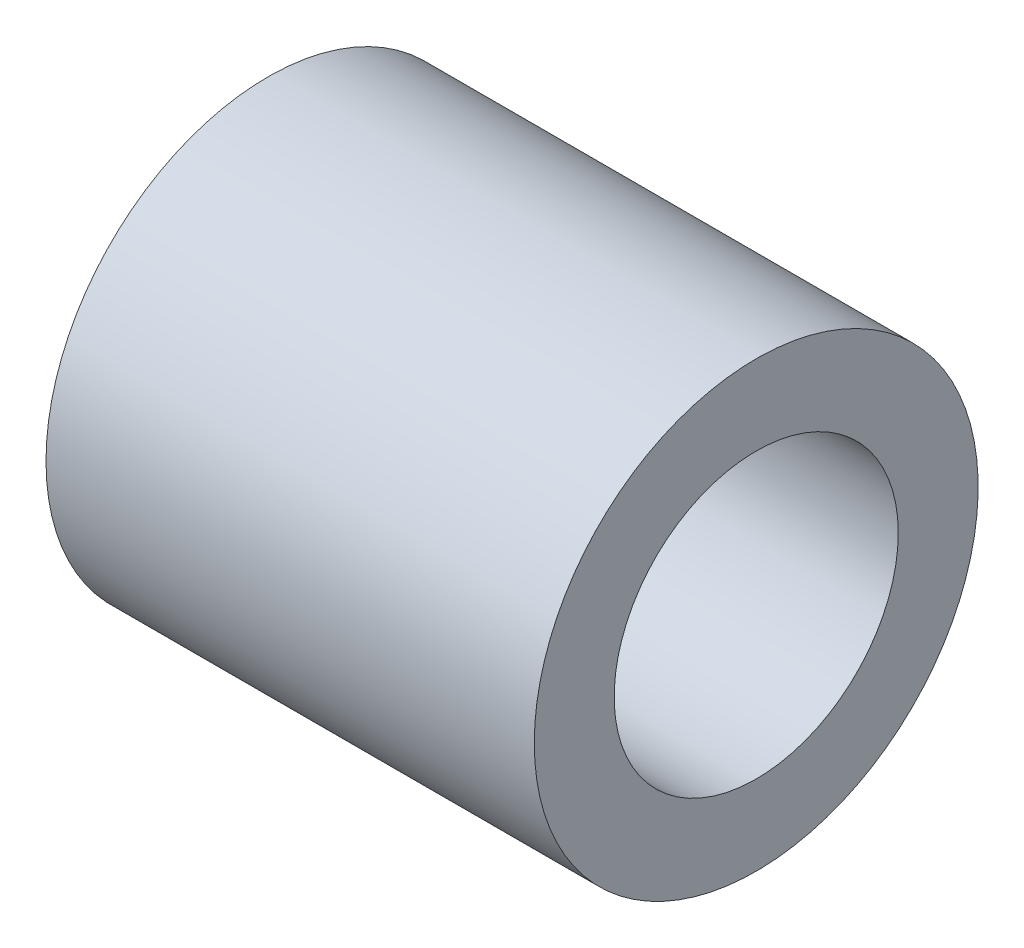
ISO-10303-21;
HEADER;
FILE_DESCRIPTION(('STEP AP214'),'2;1');
FILE_NAME('part.step','',(''),(''),'','','');
FILE_SCHEMA(('AUTOMOTIVE_DESIGN { 1 0 10303 214 1 1 1 1 }'));
ENDSEC;
DATA;
#1=APPLICATION_CONTEXT('core data for automotive mechanical design processes');
#2=APPLICATION_PROTOCOL_DEFINITION('international standard','automotive_design',2000,#1);
#3=PRODUCT_CONTEXT('',#1,'mechanical');
#4=PRODUCT('Part','Part','',(#3));
#5=PRODUCT_RELATED_PRODUCT_CATEGORY('part','',(#4));
#6=PRODUCT_DEFINITION_FORMATION('','',#4);
#7=PRODUCT_DEFINITION_CONTEXT('part definition',#1,'design');
#8=PRODUCT_DEFINITION('design','',#6,#7);
#9=PRODUCT_DEFINITION_SHAPE('','',#8);
#10=(LENGTH_UNIT() NAMED_UNIT(*) SI_UNIT(.MILLI.,.METRE.));
#11=(NAMED_UNIT(*) PLANE_ANGLE_UNIT() SI_UNIT($,.RADIAN.));
#12=(NAMED_UNIT(*) SI_UNIT($,.STERADIAN.) SOLID_ANGLE_UNIT());
#13=UNCERTAINTY_MEASURE_WITH_UNIT(LENGTH_MEASURE(1.E-05),#10,'distance_accuracy_value','');
#14=(GEOMETRIC_REPRESENTATION_CONTEXT(3) GLOBAL_UNCERTAINTY_ASSIGNED_CONTEXT((#13)) GLOBAL_UNIT_ASSIGNED_CONTEXT((#10,
#11,#12)) REPRESENTATION_CONTEXT('',''));
#15=CARTESIAN_POINT('',(0.,0.,0.));
#16=DIRECTION('',(0.,0.,1.));
#17=DIRECTION('',(1.,0.,0.));
#18=AXIS2_PLACEMENT_3D('',#15,#16,#17);
#19=CARTESIAN_POINT('',(0.,0.,0.));
#20=DIRECTION('',(1.,0.,0.));
#21=DIRECTION('',(0.,0.,-1.));
#22=AXIS2_PLACEMENT_3D('',#19,#20,#21);
#23=PLANE('',#22);
#24=CARTESIAN_POINT('',(0.,0.,0.));
#25=DIRECTION('',(1.,0.,0.));
#26=DIRECTION('',(0.,0.,-1.));
#27=AXIS2_PLACEMENT_3D('',#24,#25,#26);
#28=CIRCLE('',#27,1.6);
#29=CARTESIAN_POINT('',(0.,0.,-1.6));
#30=VERTEX_POINT('',#29);
#31=EDGE_CURVE('E40',#30,#30,#28,.F.);
#32=ORIENTED_EDGE('',*,*,#31,.F.);
#33=EDGE_LOOP('',(#32));
#34=FACE_BOUND('',#33,.T.);
#35=CARTESIAN_POINT('',(0.,0.,0.));
#36=DIRECTION('',(-1.,0.,0.));
#37=DIRECTION('',(0.,0.,1.));
#38=AXIS2_PLACEMENT_3D('',#35,#36,#37);
#39=CIRCLE('',#38,2.5);
#40=CARTESIAN_POINT('',(0.,0.,2.5));
#41=VERTEX_POINT('',#40);
#42=EDGE_CURVE('E10',#41,#41,#39,.T.);
#43=ORIENTED_EDGE('',*,*,#42,.T.);
#44=EDGE_LOOP('',(#43));
#45=FACE_BOUND('',#44,.T.);
#46=ADVANCED_FACE('F30',(#34,#45),#23,.F.);
#47=CARTESIAN_POINT('',(0.,0.,0.));
#48=DIRECTION('',(-1.,0.,0.));
#49=DIRECTION('',(0.,0.,1.));
#50=AXIS2_PLACEMENT_3D('',#47,#48,#49);
#51=CYLINDRICAL_SURFACE('',#50,2.5);
#52=ORIENTED_EDGE('',*,*,#42,.F.);
#53=EDGE_LOOP('',(#52));
#54=FACE_BOUND('',#53,.T.);
#55=CARTESIAN_POINT('',(5.5,0.,0.));
#56=DIRECTION('',(-1.,0.,0.));
#57=DIRECTION('',(0.,0.,1.));
#58=AXIS2_PLACEMENT_3D('',#55,#56,#57);
#59=CIRCLE('',#58,2.5);
#60=CARTESIAN_POINT('',(5.5,0.,2.5));
#61=VERTEX_POINT('',#60);
#62=EDGE_CURVE('E36',#61,#61,#59,.T.);
#63=ORIENTED_EDGE('',*,*,#62,.T.);
#64=EDGE_LOOP('',(#63));
#65=FACE_BOUND('',#64,.T.);
#66=ADVANCED_FACE('F55',(#54,#65),#51,.T.);
#67=CARTESIAN_POINT('',(5.5,0.,0.));
#68=DIRECTION('',(-1.,0.,0.));
#69=DIRECTION('',(0.,0.,1.));
#70=AXIS2_PLACEMENT_3D('',#67,#68,#69);
#71=PLANE('',#70);
#72=CARTESIAN_POINT('',(5.5,0.,0.));
#73=DIRECTION('',(1.,0.,0.));
#74=DIRECTION('',(0.,0.,-1.));
#75=AXIS2_PLACEMENT_3D('',#72,#73,#74);
#76=CIRCLE('',#75,1.6);
#77=CARTESIAN_POINT('',(5.5,0.,-1.6));
#78=VERTEX_POINT('',#77);
#79=EDGE_CURVE('E44',#78,#78,#76,.T.);
#80=ORIENTED_EDGE('',*,*,#79,.F.);
#81=EDGE_LOOP('',(#80));
#82=FACE_BOUND('',#81,.T.);
#83=ORIENTED_EDGE('',*,*,#62,.F.);
#84=EDGE_LOOP('',(#83));
#85=FACE_BOUND('',#84,.T.);
#86=ADVANCED_FACE('F52',(#82,#85),#71,.F.);
#87=CARTESIAN_POINT('',(-4.5254833995939,0.,0.));
#88=DIRECTION('',(1.,0.,0.));
#89=DIRECTION('',(0.,0.,-1.));
#90=AXIS2_PLACEMENT_3D('',#87,#88,#89);
#91=CYLINDRICAL_SURFACE('',#90,1.6);
#92=ORIENTED_EDGE('',*,*,#31,.T.);
#93=EDGE_LOOP('',(#92));
#94=FACE_BOUND('',#93,.T.);
#95=ORIENTED_EDGE('',*,*,#79,.T.);
#96=EDGE_LOOP('',(#95));
#97=FACE_BOUND('',#96,.T.);
#98=ADVANCED_FACE('F50',(#94,#97),#91,.F.);
#99=CLOSED_SHELL('',(#46,#66,#86,#98));
#100=MANIFOLD_SOLID_BREP('B2',#99);
#101=ADVANCED_BREP_SHAPE_REPRESENTATION('',(#18,#100),#14);
#102=SHAPE_DEFINITION_REPRESENTATION(#9,#101);
ENDSEC;
END-ISO-10303-21;
